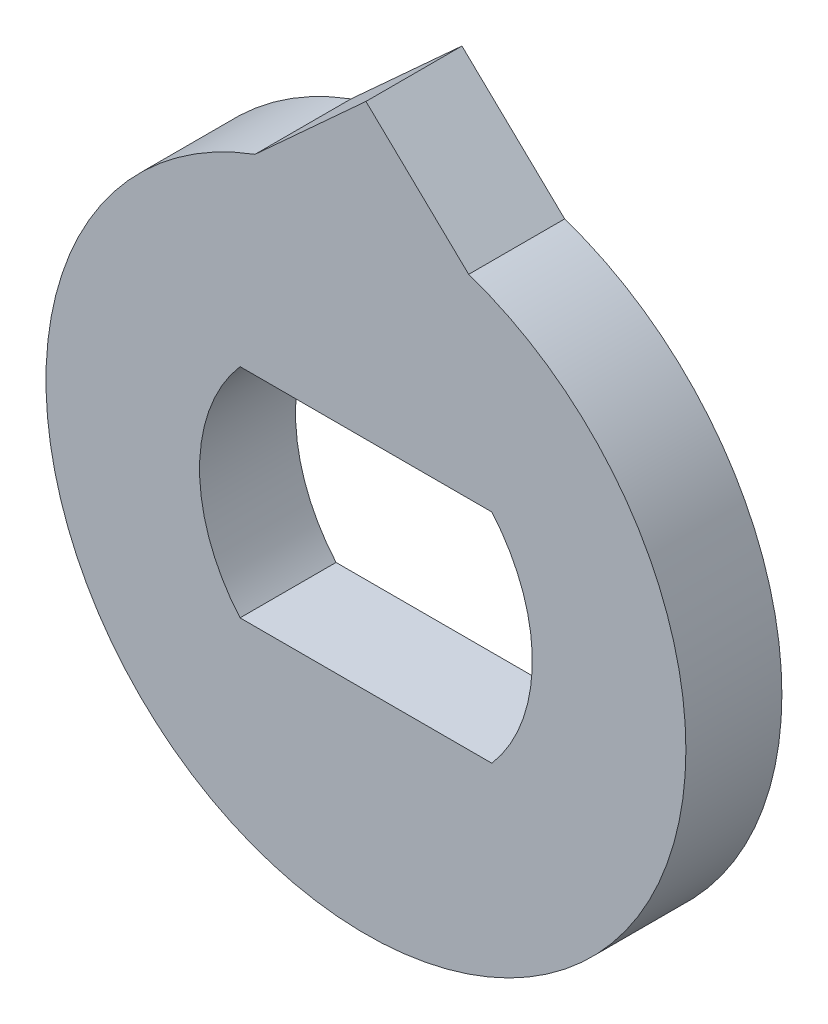
ISO-10303-21;
HEADER;
FILE_DESCRIPTION(('STEP AP214'),'2;1');
FILE_NAME('part.step','',(''),(''),'','','');
FILE_SCHEMA(('AUTOMOTIVE_DESIGN { 1 0 10303 214 1 1 1 1 }'));
ENDSEC;
DATA;
#1=APPLICATION_CONTEXT('core data for automotive mechanical design processes');
#2=APPLICATION_PROTOCOL_DEFINITION('international standard','automotive_design',2000,#1);
#3=PRODUCT_CONTEXT('',#1,'mechanical');
#4=PRODUCT('Part','Part','',(#3));
#5=PRODUCT_RELATED_PRODUCT_CATEGORY('part','',(#4));
#6=PRODUCT_DEFINITION_FORMATION('','',#4);
#7=PRODUCT_DEFINITION_CONTEXT('part definition',#1,'design');
#8=PRODUCT_DEFINITION('design','',#6,#7);
#9=PRODUCT_DEFINITION_SHAPE('','',#8);
#10=(LENGTH_UNIT() NAMED_UNIT(*) SI_UNIT(.MILLI.,.METRE.));
#11=(NAMED_UNIT(*) PLANE_ANGLE_UNIT() SI_UNIT($,.RADIAN.));
#12=(NAMED_UNIT(*) SI_UNIT($,.STERADIAN.) SOLID_ANGLE_UNIT());
#13=UNCERTAINTY_MEASURE_WITH_UNIT(LENGTH_MEASURE(1.E-05),#10,'distance_accuracy_value','');
#14=(GEOMETRIC_REPRESENTATION_CONTEXT(3) GLOBAL_UNCERTAINTY_ASSIGNED_CONTEXT((#13)) GLOBAL_UNIT_ASSIGNED_CONTEXT((#10,
#11,#12)) REPRESENTATION_CONTEXT('',''));
#15=CARTESIAN_POINT('',(0.,0.,0.));
#16=DIRECTION('',(0.,0.,1.));
#17=DIRECTION('',(1.,0.,0.));
#18=AXIS2_PLACEMENT_3D('',#15,#16,#17);
#19=CARTESIAN_POINT('',(0.,0.,1.5));
#20=DIRECTION('',(0.,0.,-1.));
#21=DIRECTION('',(-1.,0.,0.));
#22=AXIS2_PLACEMENT_3D('',#19,#20,#21);
#23=CYLINDRICAL_SURFACE('',#22,5.);
#24=CARTESIAN_POINT('',(0.,0.,0.));
#25=DIRECTION('',(0.,0.,1.));
#26=DIRECTION('',(1.,0.,0.));
#27=AXIS2_PLACEMENT_3D('',#24,#25,#26);
#28=CIRCLE('',#27,5.);
#29=CARTESIAN_POINT('',(-1.73364650858462,4.68982619968719,0.));
#30=VERTEX_POINT('',#29);
#31=CARTESIAN_POINT('',(1.60550940022527,4.73522328573725,0.));
#32=VERTEX_POINT('',#31);
#33=EDGE_CURVE('E108',#30,#32,#28,.T.);
#34=ORIENTED_EDGE('',*,*,#33,.T.);
#35=DIRECTION('',(0.,0.,-1.));
#36=VECTOR('',#35,1.);
#37=CARTESIAN_POINT('',(1.60550940022527,4.73522328573725,1.5));
#38=LINE('',#37,#36);
#39=CARTESIAN_POINT('',(1.60550940022527,4.73522328573725,1.5));
#40=VERTEX_POINT('',#39);
#41=EDGE_CURVE('E11',#40,#32,#38,.T.);
#42=ORIENTED_EDGE('',*,*,#41,.F.);
#43=CARTESIAN_POINT('',(0.,0.,1.5));
#44=DIRECTION('',(0.,0.,1.));
#45=DIRECTION('',(1.,0.,0.));
#46=AXIS2_PLACEMENT_3D('',#43,#44,#45);
#47=CIRCLE('',#46,5.);
#48=CARTESIAN_POINT('',(-1.73364650858462,4.68982619968719,1.5));
#49=VERTEX_POINT('',#48);
#50=EDGE_CURVE('E100',#49,#40,#47,.T.);
#51=ORIENTED_EDGE('',*,*,#50,.F.);
#52=DIRECTION('',(0.,0.,-1.));
#53=VECTOR('',#52,1.);
#54=CARTESIAN_POINT('',(-1.73364650858462,4.68982619968719,1.5));
#55=LINE('',#54,#53);
#56=EDGE_CURVE('E54',#49,#30,#55,.T.);
#57=ORIENTED_EDGE('',*,*,#56,.T.);
#58=EDGE_LOOP('',(#34,#42,#51,#57));
#59=FACE_BOUND('',#58,.T.);
#60=ADVANCED_FACE('F35',(#59),#23,.T.);
#61=CARTESIAN_POINT('',(3.13334618400248,3.2722349540983,1.5));
#62=DIRECTION('',(0.691612410742162,0.722268837281116,0.));
#63=DIRECTION('',(-0.722268837281116,0.691612410742162,0.));
#64=AXIS2_PLACEMENT_3D('',#61,#62,#63);
#65=PLANE('',#64);
#66=DIRECTION('',(0.722268837281116,-0.691612410742162,0.));
#67=VECTOR('',#66,1.);
#68=CARTESIAN_POINT('',(3.13334618400248,3.2722349540983,0.));
#69=LINE('',#68,#67);
#70=CARTESIAN_POINT('',(0.,6.27258744911292,0.));
#71=VERTEX_POINT('',#70);
#72=EDGE_CURVE('E130',#71,#32,#69,.T.);
#73=ORIENTED_EDGE('',*,*,#72,.F.);
#74=DIRECTION('',(0.,0.,-1.));
#75=VECTOR('',#74,1.);
#76=CARTESIAN_POINT('',(0.,6.27258744911292,1.5));
#77=LINE('',#76,#75);
#78=CARTESIAN_POINT('',(0.,6.27258744911292,1.5));
#79=VERTEX_POINT('',#78);
#80=EDGE_CURVE('E45',#79,#71,#77,.T.);
#81=ORIENTED_EDGE('',*,*,#80,.F.);
#82=DIRECTION('',(0.722268837281116,-0.691612410742162,0.));
#83=VECTOR('',#82,1.);
#84=CARTESIAN_POINT('',(3.13334618400248,3.2722349540983,1.5));
#85=LINE('',#84,#83);
#86=EDGE_CURVE('E104',#79,#40,#85,.T.);
#87=ORIENTED_EDGE('',*,*,#86,.T.);
#88=ORIENTED_EDGE('',*,*,#41,.T.);
#89=EDGE_LOOP('',(#73,#81,#87,#88));
#90=FACE_BOUND('',#89,.T.);
#91=ADVANCED_FACE('F111',(#90),#65,.T.);
#92=CARTESIAN_POINT('',(0.,0.,1.5));
#93=DIRECTION('',(0.,0.,-1.));
#94=DIRECTION('',(-1.,0.,0.));
#95=AXIS2_PLACEMENT_3D('',#92,#93,#94);
#96=CYLINDRICAL_SURFACE('',#95,2.6);
#97=CARTESIAN_POINT('',(0.,0.,0.));
#98=DIRECTION('',(0.,0.,1.));
#99=DIRECTION('',(1.,0.,0.));
#100=AXIS2_PLACEMENT_3D('',#97,#98,#99);
#101=CIRCLE('',#100,2.6);
#102=CARTESIAN_POINT('',(-1.9672315572906,1.7,0.));
#103=VERTEX_POINT('',#102);
#104=CARTESIAN_POINT('',(-1.9672315572906,-1.7,0.));
#105=VERTEX_POINT('',#104);
#106=EDGE_CURVE('E117',#103,#105,#101,.T.);
#107=ORIENTED_EDGE('',*,*,#106,.F.);
#108=DIRECTION('',(0.,0.,-1.));
#109=VECTOR('',#108,1.);
#110=CARTESIAN_POINT('',(-1.9672315572906,1.7,1.5));
#111=LINE('',#110,#109);
#112=CARTESIAN_POINT('',(-1.9672315572906,1.7,1.5));
#113=VERTEX_POINT('',#112);
#114=EDGE_CURVE('E39',#113,#103,#111,.T.);
#115=ORIENTED_EDGE('',*,*,#114,.F.);
#116=CARTESIAN_POINT('',(0.,0.,1.5));
#117=DIRECTION('',(0.,0.,1.));
#118=DIRECTION('',(1.,0.,0.));
#119=AXIS2_PLACEMENT_3D('',#116,#117,#118);
#120=CIRCLE('',#119,2.6);
#121=CARTESIAN_POINT('',(-1.9672315572906,-1.7,1.5));
#122=VERTEX_POINT('',#121);
#123=EDGE_CURVE('E135',#113,#122,#120,.T.);
#124=ORIENTED_EDGE('',*,*,#123,.T.);
#125=DIRECTION('',(0.,0.,-1.));
#126=VECTOR('',#125,1.);
#127=CARTESIAN_POINT('',(-1.9672315572906,-1.7,1.5));
#128=LINE('',#127,#126);
#129=EDGE_CURVE('E113',#122,#105,#128,.T.);
#130=ORIENTED_EDGE('',*,*,#129,.T.);
#131=EDGE_LOOP('',(#107,#115,#124,#130));
#132=FACE_BOUND('',#131,.T.);
#133=ADVANCED_FACE('F37',(#132),#96,.F.);
#134=CARTESIAN_POINT('',(0.,1.7,1.5));
#135=DIRECTION('',(0.,1.,0.));
#136=DIRECTION('',(0.,0.,1.));
#137=AXIS2_PLACEMENT_3D('',#134,#135,#136);
#138=PLANE('',#137);
#139=DIRECTION('',(1.,0.,0.));
#140=VECTOR('',#139,1.);
#141=CARTESIAN_POINT('',(0.,1.7,0.));
#142=LINE('',#141,#140);
#143=CARTESIAN_POINT('',(1.9672315572906,1.7,0.));
#144=VERTEX_POINT('',#143);
#145=EDGE_CURVE('E120',#103,#144,#142,.T.);
#146=ORIENTED_EDGE('',*,*,#145,.T.);
#147=DIRECTION('',(0.,0.,-1.));
#148=VECTOR('',#147,1.);
#149=CARTESIAN_POINT('',(1.9672315572906,1.7,1.5));
#150=LINE('',#149,#148);
#151=CARTESIAN_POINT('',(1.9672315572906,1.7,1.5));
#152=VERTEX_POINT('',#151);
#153=EDGE_CURVE('E140',#152,#144,#150,.T.);
#154=ORIENTED_EDGE('',*,*,#153,.F.);
#155=DIRECTION('',(1.,0.,0.));
#156=VECTOR('',#155,1.);
#157=CARTESIAN_POINT('',(0.,1.7,1.5));
#158=LINE('',#157,#156);
#159=EDGE_CURVE('E148',#113,#152,#158,.T.);
#160=ORIENTED_EDGE('',*,*,#159,.F.);
#161=ORIENTED_EDGE('',*,*,#114,.T.);
#162=EDGE_LOOP('',(#146,#154,#160,#161));
#163=FACE_BOUND('',#162,.T.);
#164=ADVANCED_FACE('F147',(#163),#138,.F.);
#165=CARTESIAN_POINT('',(0.,0.,1.5));
#166=DIRECTION('',(0.,0.,-1.));
#167=DIRECTION('',(-1.,0.,0.));
#168=AXIS2_PLACEMENT_3D('',#165,#166,#167);
#169=CYLINDRICAL_SURFACE('',#168,2.6);
#170=CARTESIAN_POINT('',(0.,0.,0.));
#171=DIRECTION('',(0.,0.,1.));
#172=DIRECTION('',(1.,0.,0.));
#173=AXIS2_PLACEMENT_3D('',#170,#171,#172);
#174=CIRCLE('',#173,2.6);
#175=CARTESIAN_POINT('',(1.9672315572906,-1.7,0.));
#176=VERTEX_POINT('',#175);
#177=EDGE_CURVE('E123',#176,#144,#174,.T.);
#178=ORIENTED_EDGE('',*,*,#177,.F.);
#179=DIRECTION('',(0.,0.,-1.));
#180=VECTOR('',#179,1.);
#181=CARTESIAN_POINT('',(1.9672315572906,-1.7,1.5));
#182=LINE('',#181,#180);
#183=CARTESIAN_POINT('',(1.9672315572906,-1.7,1.5));
#184=VERTEX_POINT('',#183);
#185=EDGE_CURVE('E139',#184,#176,#182,.T.);
#186=ORIENTED_EDGE('',*,*,#185,.F.);
#187=CARTESIAN_POINT('',(0.,0.,1.5));
#188=DIRECTION('',(0.,0.,1.));
#189=DIRECTION('',(1.,0.,0.));
#190=AXIS2_PLACEMENT_3D('',#187,#188,#189);
#191=CIRCLE('',#190,2.6);
#192=EDGE_CURVE('E184',#184,#152,#191,.T.);
#193=ORIENTED_EDGE('',*,*,#192,.T.);
#194=ORIENTED_EDGE('',*,*,#153,.T.);
#195=EDGE_LOOP('',(#178,#186,#193,#194));
#196=FACE_BOUND('',#195,.T.);
#197=ADVANCED_FACE('F159',(#196),#169,.F.);
#198=CARTESIAN_POINT('',(0.,-1.7,1.5));
#199=DIRECTION('',(0.,1.,0.));
#200=DIRECTION('',(0.,0.,1.));
#201=AXIS2_PLACEMENT_3D('',#198,#199,#200);
#202=PLANE('',#201);
#203=DIRECTION('',(1.,0.,0.));
#204=VECTOR('',#203,1.);
#205=CARTESIAN_POINT('',(0.,-1.7,0.));
#206=LINE('',#205,#204);
#207=EDGE_CURVE('E126',#105,#176,#206,.T.);
#208=ORIENTED_EDGE('',*,*,#207,.F.);
#209=ORIENTED_EDGE('',*,*,#129,.F.);
#210=DIRECTION('',(1.,0.,0.));
#211=VECTOR('',#210,1.);
#212=CARTESIAN_POINT('',(0.,-1.7,1.5));
#213=LINE('',#212,#211);
#214=EDGE_CURVE('E106',#122,#184,#213,.T.);
#215=ORIENTED_EDGE('',*,*,#214,.T.);
#216=ORIENTED_EDGE('',*,*,#185,.T.);
#217=EDGE_LOOP('',(#208,#209,#215,#216));
#218=FACE_BOUND('',#217,.T.);
#219=ADVANCED_FACE('F157',(#218),#202,.T.);
#220=CARTESIAN_POINT('',(-3.12333666449984,3.42108559045724,1.5));
#221=DIRECTION('',(-0.674238374859164,0.738513787188346,0.));
#222=DIRECTION('',(-0.738513787188346,-0.674238374859164,0.));
#223=AXIS2_PLACEMENT_3D('',#220,#221,#222);
#224=PLANE('',#223);
#225=DIRECTION('',(0.738513787188346,0.674238374859164,0.));
#226=VECTOR('',#225,1.);
#227=CARTESIAN_POINT('',(-3.12333666449984,3.42108559045724,0.));
#228=LINE('',#227,#226);
#229=EDGE_CURVE('E132',#30,#71,#228,.T.);
#230=ORIENTED_EDGE('',*,*,#229,.F.);
#231=ORIENTED_EDGE('',*,*,#56,.F.);
#232=DIRECTION('',(0.738513787188346,0.674238374859164,0.));
#233=VECTOR('',#232,1.);
#234=CARTESIAN_POINT('',(-3.12333666449984,3.42108559045724,1.5));
#235=LINE('',#234,#233);
#236=EDGE_CURVE('E105',#49,#79,#235,.T.);
#237=ORIENTED_EDGE('',*,*,#236,.T.);
#238=ORIENTED_EDGE('',*,*,#80,.T.);
#239=EDGE_LOOP('',(#230,#231,#237,#238));
#240=FACE_BOUND('',#239,.T.);
#241=ADVANCED_FACE('F166',(#240),#224,.T.);
#242=CARTESIAN_POINT('',(0.,0.,1.5));
#243=DIRECTION('',(0.,0.,1.));
#244=DIRECTION('',(1.,0.,0.));
#245=AXIS2_PLACEMENT_3D('',#242,#243,#244);
#246=PLANE('',#245);
#247=ORIENTED_EDGE('',*,*,#123,.F.);
#248=ORIENTED_EDGE('',*,*,#159,.T.);
#249=ORIENTED_EDGE('',*,*,#192,.F.);
#250=ORIENTED_EDGE('',*,*,#214,.F.);
#251=EDGE_LOOP('',(#247,#248,#249,#250));
#252=FACE_BOUND('',#251,.T.);
#253=ORIENTED_EDGE('',*,*,#50,.T.);
#254=ORIENTED_EDGE('',*,*,#86,.F.);
#255=ORIENTED_EDGE('',*,*,#236,.F.);
#256=EDGE_LOOP('',(#253,#254,#255));
#257=FACE_BOUND('',#256,.T.);
#258=ADVANCED_FACE('F102',(#252,#257),#246,.T.);
#259=CARTESIAN_POINT('',(0.,0.,0.));
#260=DIRECTION('',(0.,0.,1.));
#261=DIRECTION('',(1.,0.,0.));
#262=AXIS2_PLACEMENT_3D('',#259,#260,#261);
#263=PLANE('',#262);
#264=ORIENTED_EDGE('',*,*,#106,.T.);
#265=ORIENTED_EDGE('',*,*,#207,.T.);
#266=ORIENTED_EDGE('',*,*,#177,.T.);
#267=ORIENTED_EDGE('',*,*,#145,.F.);
#268=EDGE_LOOP('',(#264,#265,#266,#267));
#269=FACE_BOUND('',#268,.T.);
#270=ORIENTED_EDGE('',*,*,#33,.F.);
#271=ORIENTED_EDGE('',*,*,#229,.T.);
#272=ORIENTED_EDGE('',*,*,#72,.T.);
#273=EDGE_LOOP('',(#270,#271,#272));
#274=FACE_BOUND('',#273,.T.);
#275=ADVANCED_FACE('F151',(#269,#274),#263,.F.);
#276=CLOSED_SHELL('',(#60,#91,#133,#164,#197,#219,#241,#258,#275));
#277=MANIFOLD_SOLID_BREP('B2',#276);
#278=ADVANCED_BREP_SHAPE_REPRESENTATION('',(#18,#277),#14);
#279=SHAPE_DEFINITION_REPRESENTATION(#9,#278);
ENDSEC;
END-ISO-10303-21;
